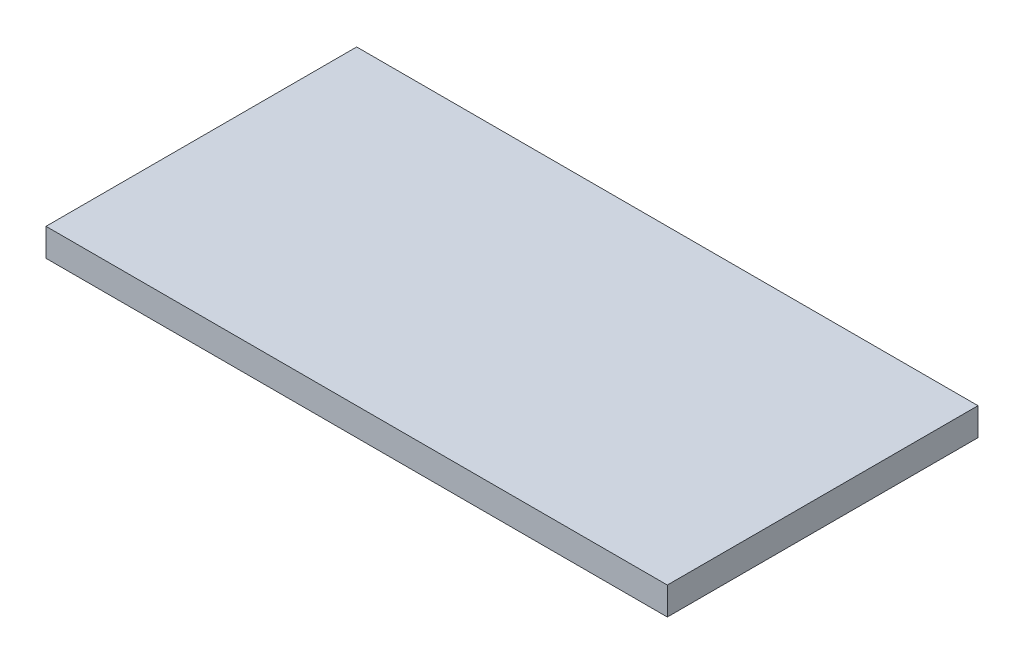
ISO-10303-21;
HEADER;
FILE_DESCRIPTION(('STEP AP214'),'2;1');
FILE_NAME('part.step','',(''),(''),'','','');
FILE_SCHEMA(('AUTOMOTIVE_DESIGN { 1 0 10303 214 1 1 1 1 }'));
ENDSEC;
DATA;
#1=APPLICATION_CONTEXT('core data for automotive mechanical design processes');
#2=APPLICATION_PROTOCOL_DEFINITION('international standard','automotive_design',2000,#1);
#3=PRODUCT_CONTEXT('',#1,'mechanical');
#4=PRODUCT('Part','Part','',(#3));
#5=PRODUCT_RELATED_PRODUCT_CATEGORY('part','',(#4));
#6=PRODUCT_DEFINITION_FORMATION('','',#4);
#7=PRODUCT_DEFINITION_CONTEXT('part definition',#1,'design');
#8=PRODUCT_DEFINITION('design','',#6,#7);
#9=PRODUCT_DEFINITION_SHAPE('','',#8);
#10=(LENGTH_UNIT() NAMED_UNIT(*) SI_UNIT(.MILLI.,.METRE.));
#11=(NAMED_UNIT(*) PLANE_ANGLE_UNIT() SI_UNIT($,.RADIAN.));
#12=(NAMED_UNIT(*) SI_UNIT($,.STERADIAN.) SOLID_ANGLE_UNIT());
#13=UNCERTAINTY_MEASURE_WITH_UNIT(LENGTH_MEASURE(1.E-05),#10,'distance_accuracy_value','');
#14=(GEOMETRIC_REPRESENTATION_CONTEXT(3) GLOBAL_UNCERTAINTY_ASSIGNED_CONTEXT((#13)) GLOBAL_UNIT_ASSIGNED_CONTEXT((#10,
#11,#12)) REPRESENTATION_CONTEXT('',''));
#15=CARTESIAN_POINT('',(0.,0.,0.));
#16=DIRECTION('',(0.,0.,1.));
#17=DIRECTION('',(1.,0.,0.));
#18=AXIS2_PLACEMENT_3D('',#15,#16,#17);
#19=CARTESIAN_POINT('',(0.,1.5875,0.));
#20=DIRECTION('',(1.,0.,0.));
#21=DIRECTION('',(0.,0.,-1.));
#22=AXIS2_PLACEMENT_3D('',#19,#20,#21);
#23=PLANE('',#22);
#24=DIRECTION('',(0.,0.,1.));
#25=VECTOR('',#24,1.);
#26=CARTESIAN_POINT('',(0.,0.,0.));
#27=LINE('',#26,#25);
#28=CARTESIAN_POINT('',(0.,0.,-17.78));
#29=VERTEX_POINT('',#28);
#30=CARTESIAN_POINT('',(0.,0.,0.));
#31=VERTEX_POINT('',#30);
#32=EDGE_CURVE('E100',#29,#31,#27,.T.);
#33=ORIENTED_EDGE('',*,*,#32,.T.);
#34=DIRECTION('',(0.,-1.,0.));
#35=VECTOR('',#34,1.);
#36=CARTESIAN_POINT('',(0.,1.5875,0.));
#37=LINE('',#36,#35);
#38=CARTESIAN_POINT('',(0.,1.5875,0.));
#39=VERTEX_POINT('',#38);
#40=EDGE_CURVE('E11',#39,#31,#37,.T.);
#41=ORIENTED_EDGE('',*,*,#40,.F.);
#42=DIRECTION('',(0.,0.,1.));
#43=VECTOR('',#42,1.);
#44=CARTESIAN_POINT('',(0.,1.5875,0.));
#45=LINE('',#44,#43);
#46=CARTESIAN_POINT('',(0.,1.5875,-17.78));
#47=VERTEX_POINT('',#46);
#48=EDGE_CURVE('E88',#47,#39,#45,.T.);
#49=ORIENTED_EDGE('',*,*,#48,.F.);
#50=DIRECTION('',(0.,-1.,0.));
#51=VECTOR('',#50,1.);
#52=CARTESIAN_POINT('',(0.,1.5875,-17.78));
#53=LINE('',#52,#51);
#54=EDGE_CURVE('E96',#47,#29,#53,.T.);
#55=ORIENTED_EDGE('',*,*,#54,.T.);
#56=EDGE_LOOP('',(#33,#41,#49,#55));
#57=FACE_BOUND('',#56,.T.);
#58=ADVANCED_FACE('F37',(#57),#23,.F.);
#59=CARTESIAN_POINT('',(0.,1.5875,0.));
#60=DIRECTION('',(0.,0.,-1.));
#61=DIRECTION('',(-1.,0.,0.));
#62=AXIS2_PLACEMENT_3D('',#59,#60,#61);
#63=PLANE('',#62);
#64=DIRECTION('',(1.,0.,0.));
#65=VECTOR('',#64,1.);
#66=CARTESIAN_POINT('',(0.,0.,0.));
#67=LINE('',#66,#65);
#68=CARTESIAN_POINT('',(35.56,0.,0.));
#69=VERTEX_POINT('',#68);
#70=EDGE_CURVE('E92',#31,#69,#67,.T.);
#71=ORIENTED_EDGE('',*,*,#70,.T.);
#72=DIRECTION('',(0.,-1.,0.));
#73=VECTOR('',#72,1.);
#74=CARTESIAN_POINT('',(35.56,1.5875,0.));
#75=LINE('',#74,#73);
#76=CARTESIAN_POINT('',(35.56,1.5875,0.));
#77=VERTEX_POINT('',#76);
#78=EDGE_CURVE('E45',#77,#69,#75,.T.);
#79=ORIENTED_EDGE('',*,*,#78,.F.);
#80=DIRECTION('',(1.,0.,0.));
#81=VECTOR('',#80,1.);
#82=CARTESIAN_POINT('',(0.,1.5875,0.));
#83=LINE('',#82,#81);
#84=EDGE_CURVE('E83',#39,#77,#83,.T.);
#85=ORIENTED_EDGE('',*,*,#84,.F.);
#86=ORIENTED_EDGE('',*,*,#40,.T.);
#87=EDGE_LOOP('',(#71,#79,#85,#86));
#88=FACE_BOUND('',#87,.T.);
#89=ADVANCED_FACE('F91',(#88),#63,.F.);
#90=CARTESIAN_POINT('',(35.56,1.5875,0.));
#91=DIRECTION('',(-1.,0.,0.));
#92=DIRECTION('',(0.,0.,1.));
#93=AXIS2_PLACEMENT_3D('',#90,#91,#92);
#94=PLANE('',#93);
#95=DIRECTION('',(0.,0.,-1.));
#96=VECTOR('',#95,1.);
#97=CARTESIAN_POINT('',(35.56,0.,0.));
#98=LINE('',#97,#96);
#99=CARTESIAN_POINT('',(35.56,0.,-17.78));
#100=VERTEX_POINT('',#99);
#101=EDGE_CURVE('E70',#69,#100,#98,.T.);
#102=ORIENTED_EDGE('',*,*,#101,.T.);
#103=DIRECTION('',(0.,-1.,0.));
#104=VECTOR('',#103,1.);
#105=CARTESIAN_POINT('',(35.56,1.5875,-17.78));
#106=LINE('',#105,#104);
#107=CARTESIAN_POINT('',(35.56,1.5875,-17.78));
#108=VERTEX_POINT('',#107);
#109=EDGE_CURVE('E93',#108,#100,#106,.T.);
#110=ORIENTED_EDGE('',*,*,#109,.F.);
#111=DIRECTION('',(0.,0.,-1.));
#112=VECTOR('',#111,1.);
#113=CARTESIAN_POINT('',(35.56,1.5875,0.));
#114=LINE('',#113,#112);
#115=EDGE_CURVE('E86',#77,#108,#114,.T.);
#116=ORIENTED_EDGE('',*,*,#115,.F.);
#117=ORIENTED_EDGE('',*,*,#78,.T.);
#118=EDGE_LOOP('',(#102,#110,#116,#117));
#119=FACE_BOUND('',#118,.T.);
#120=ADVANCED_FACE('F94',(#119),#94,.F.);
#121=CARTESIAN_POINT('',(0.,1.5875,-17.78));
#122=DIRECTION('',(0.,0.,1.));
#123=DIRECTION('',(1.,0.,0.));
#124=AXIS2_PLACEMENT_3D('',#121,#122,#123);
#125=PLANE('',#124);
#126=DIRECTION('',(-1.,0.,0.));
#127=VECTOR('',#126,1.);
#128=CARTESIAN_POINT('',(0.,0.,-17.78));
#129=LINE('',#128,#127);
#130=EDGE_CURVE('E76',#100,#29,#129,.T.);
#131=ORIENTED_EDGE('',*,*,#130,.T.);
#132=ORIENTED_EDGE('',*,*,#54,.F.);
#133=DIRECTION('',(-1.,0.,0.));
#134=VECTOR('',#133,1.);
#135=CARTESIAN_POINT('',(0.,1.5875,-17.78));
#136=LINE('',#135,#134);
#137=EDGE_CURVE('E53',#108,#47,#136,.T.);
#138=ORIENTED_EDGE('',*,*,#137,.F.);
#139=ORIENTED_EDGE('',*,*,#109,.T.);
#140=EDGE_LOOP('',(#131,#132,#138,#139));
#141=FACE_BOUND('',#140,.T.);
#142=ADVANCED_FACE('F107',(#141),#125,.F.);
#143=CARTESIAN_POINT('',(0.,1.5875,0.));
#144=DIRECTION('',(0.,-1.,0.));
#145=DIRECTION('',(0.,0.,-1.));
#146=AXIS2_PLACEMENT_3D('',#143,#144,#145);
#147=PLANE('',#146);
#148=ORIENTED_EDGE('',*,*,#48,.T.);
#149=ORIENTED_EDGE('',*,*,#84,.T.);
#150=ORIENTED_EDGE('',*,*,#115,.T.);
#151=ORIENTED_EDGE('',*,*,#137,.T.);
#152=EDGE_LOOP('',(#148,#149,#150,#151));
#153=FACE_BOUND('',#152,.T.);
#154=ADVANCED_FACE('F84',(#153),#147,.F.);
#155=CARTESIAN_POINT('',(0.,0.,0.));
#156=DIRECTION('',(0.,-1.,0.));
#157=DIRECTION('',(0.,0.,-1.));
#158=AXIS2_PLACEMENT_3D('',#155,#156,#157);
#159=PLANE('',#158);
#160=ORIENTED_EDGE('',*,*,#32,.F.);
#161=ORIENTED_EDGE('',*,*,#130,.F.);
#162=ORIENTED_EDGE('',*,*,#101,.F.);
#163=ORIENTED_EDGE('',*,*,#70,.F.);
#164=EDGE_LOOP('',(#160,#161,#162,#163));
#165=FACE_BOUND('',#164,.T.);
#166=ADVANCED_FACE('F110',(#165),#159,.T.);
#167=CLOSED_SHELL('',(#58,#89,#120,#142,#154,#166));
#168=MANIFOLD_SOLID_BREP('B2',#167);
#169=ADVANCED_BREP_SHAPE_REPRESENTATION('',(#18,#168),#14);
#170=SHAPE_DEFINITION_REPRESENTATION(#9,#169);
ENDSEC;
END-ISO-10303-21;
